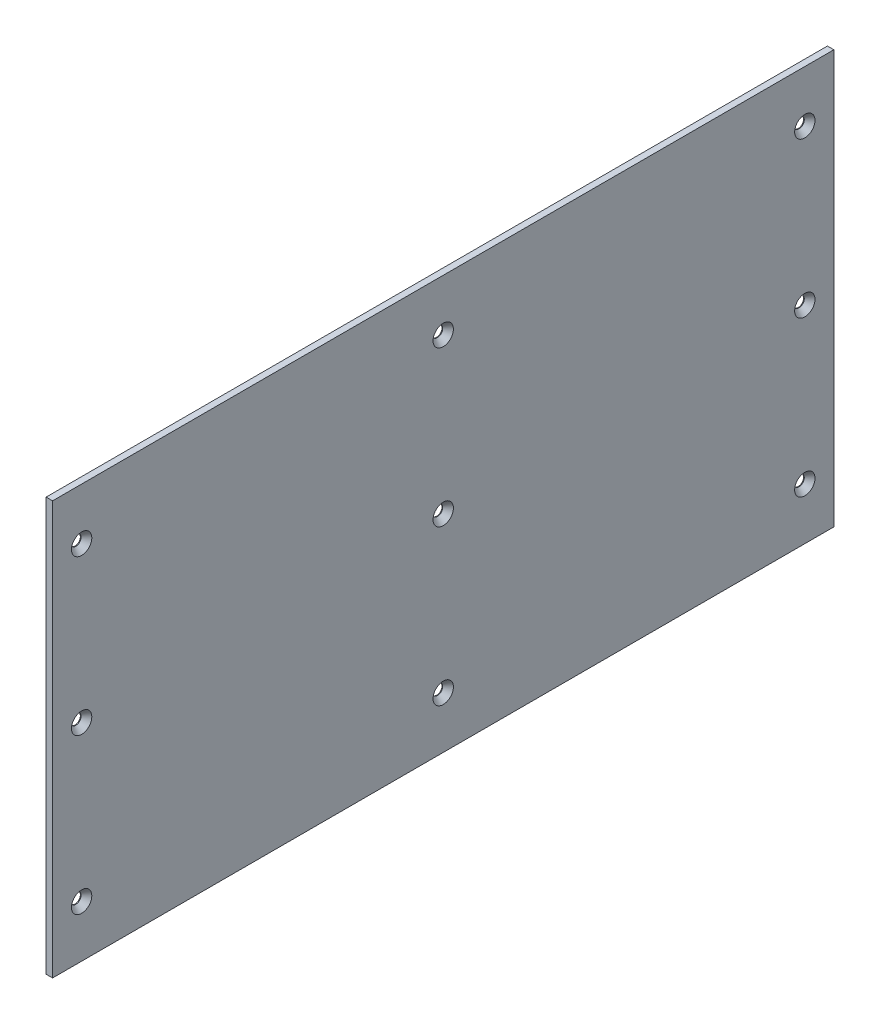
ISO-10303-21;
HEADER;
FILE_DESCRIPTION(('STEP AP214'),'2;1');
FILE_NAME('part.step','',(''),(''),'','','');
FILE_SCHEMA(('AUTOMOTIVE_DESIGN { 1 0 10303 214 1 1 1 1 }'));
ENDSEC;
DATA;
#1=APPLICATION_CONTEXT('core data for automotive mechanical design processes');
#2=APPLICATION_PROTOCOL_DEFINITION('international standard','automotive_design',2000,#1);
#3=PRODUCT_CONTEXT('',#1,'mechanical');
#4=PRODUCT('Part','Part','',(#3));
#5=PRODUCT_RELATED_PRODUCT_CATEGORY('part','',(#4));
#6=PRODUCT_DEFINITION_FORMATION('','',#4);
#7=PRODUCT_DEFINITION_CONTEXT('part definition',#1,'design');
#8=PRODUCT_DEFINITION('design','',#6,#7);
#9=PRODUCT_DEFINITION_SHAPE('','',#8);
#10=(LENGTH_UNIT() NAMED_UNIT(*) SI_UNIT(.MILLI.,.METRE.));
#11=(NAMED_UNIT(*) PLANE_ANGLE_UNIT() SI_UNIT($,.RADIAN.));
#12=(NAMED_UNIT(*) SI_UNIT($,.STERADIAN.) SOLID_ANGLE_UNIT());
#13=UNCERTAINTY_MEASURE_WITH_UNIT(LENGTH_MEASURE(1.E-05),#10,'distance_accuracy_value','');
#14=(GEOMETRIC_REPRESENTATION_CONTEXT(3) GLOBAL_UNCERTAINTY_ASSIGNED_CONTEXT((#13)) GLOBAL_UNIT_ASSIGNED_CONTEXT((#10,
#11,#12)) REPRESENTATION_CONTEXT('',''));
#15=CARTESIAN_POINT('',(0.,0.,0.));
#16=DIRECTION('',(0.,0.,1.));
#17=DIRECTION('',(1.,0.,0.));
#18=AXIS2_PLACEMENT_3D('',#15,#16,#17);
#19=CARTESIAN_POINT('',(3.175,-128.530668257757,187.628102625298));
#20=DIRECTION('',(0.,0.,-1.));
#21=DIRECTION('',(-1.,0.,0.));
#22=AXIS2_PLACEMENT_3D('',#19,#20,#21);
#23=PLANE('',#22);
#24=DIRECTION('',(0.,-1.,0.));
#25=VECTOR('',#24,1.);
#26=CARTESIAN_POINT('',(0.,-128.530668257757,187.628102625298));
#27=LINE('',#26,#25);
#28=CARTESIAN_POINT('',(0.,74.6693317422434,187.628102625298));
#29=VERTEX_POINT('',#28);
#30=CARTESIAN_POINT('',(0.,-128.530668257757,187.628102625298));
#31=VERTEX_POINT('',#30);
#32=EDGE_CURVE('E96',#29,#31,#27,.T.);
#33=ORIENTED_EDGE('',*,*,#32,.T.);
#34=DIRECTION('',(-1.,0.,0.));
#35=VECTOR('',#34,1.);
#36=CARTESIAN_POINT('',(3.175,-128.530668257757,187.628102625298));
#37=LINE('',#36,#35);
#38=CARTESIAN_POINT('',(3.175,-128.530668257757,187.628102625298));
#39=VERTEX_POINT('',#38);
#40=EDGE_CURVE('E11',#39,#31,#37,.T.);
#41=ORIENTED_EDGE('',*,*,#40,.F.);
#42=DIRECTION('',(0.,-1.,0.));
#43=VECTOR('',#42,1.);
#44=CARTESIAN_POINT('',(3.175,-128.530668257757,187.628102625298));
#45=LINE('',#44,#43);
#46=CARTESIAN_POINT('',(3.175,74.6693317422434,187.628102625298));
#47=VERTEX_POINT('',#46);
#48=EDGE_CURVE('E84',#47,#39,#45,.T.);
#49=ORIENTED_EDGE('',*,*,#48,.F.);
#50=DIRECTION('',(-1.,0.,0.));
#51=VECTOR('',#50,1.);
#52=CARTESIAN_POINT('',(3.175,74.6693317422434,187.628102625298));
#53=LINE('',#52,#51);
#54=EDGE_CURVE('E92',#47,#29,#53,.T.);
#55=ORIENTED_EDGE('',*,*,#54,.T.);
#56=EDGE_LOOP('',(#33,#41,#49,#55));
#57=FACE_BOUND('',#56,.T.);
#58=ADVANCED_FACE('F33',(#57),#23,.F.);
#59=CARTESIAN_POINT('',(3.175,-128.530668257757,187.628102625298));
#60=DIRECTION('',(0.,1.,0.));
#61=DIRECTION('',(0.,0.,1.));
#62=AXIS2_PLACEMENT_3D('',#59,#60,#61);
#63=PLANE('',#62);
#64=DIRECTION('',(0.,0.,-1.));
#65=VECTOR('',#64,1.);
#66=CARTESIAN_POINT('',(0.,-128.530668257757,187.628102625298));
#67=LINE('',#66,#65);
#68=CARTESIAN_POINT('',(0.,-128.530668257757,-196.546897374702));
#69=VERTEX_POINT('',#68);
#70=EDGE_CURVE('E88',#31,#69,#67,.T.);
#71=ORIENTED_EDGE('',*,*,#70,.T.);
#72=DIRECTION('',(-1.,0.,0.));
#73=VECTOR('',#72,1.);
#74=CARTESIAN_POINT('',(3.175,-128.530668257757,-196.546897374702));
#75=LINE('',#74,#73);
#76=CARTESIAN_POINT('',(3.175,-128.530668257757,-196.546897374702));
#77=VERTEX_POINT('',#76);
#78=EDGE_CURVE('E41',#77,#69,#75,.T.);
#79=ORIENTED_EDGE('',*,*,#78,.F.);
#80=DIRECTION('',(0.,0.,-1.));
#81=VECTOR('',#80,1.);
#82=CARTESIAN_POINT('',(3.175,-128.530668257757,187.628102625298));
#83=LINE('',#82,#81);
#84=EDGE_CURVE('E79',#39,#77,#83,.T.);
#85=ORIENTED_EDGE('',*,*,#84,.F.);
#86=ORIENTED_EDGE('',*,*,#40,.T.);
#87=EDGE_LOOP('',(#71,#79,#85,#86));
#88=FACE_BOUND('',#87,.T.);
#89=ADVANCED_FACE('F87',(#88),#63,.F.);
#90=CARTESIAN_POINT('',(3.175,-128.530668257757,-196.546897374702));
#91=DIRECTION('',(0.,0.,1.));
#92=DIRECTION('',(1.,0.,0.));
#93=AXIS2_PLACEMENT_3D('',#90,#91,#92);
#94=PLANE('',#93);
#95=DIRECTION('',(0.,1.,0.));
#96=VECTOR('',#95,1.);
#97=CARTESIAN_POINT('',(0.,-128.530668257757,-196.546897374702));
#98=LINE('',#97,#96);
#99=CARTESIAN_POINT('',(0.,74.6693317422434,-196.546897374702));
#100=VERTEX_POINT('',#99);
#101=EDGE_CURVE('E66',#69,#100,#98,.T.);
#102=ORIENTED_EDGE('',*,*,#101,.T.);
#103=DIRECTION('',(-1.,0.,0.));
#104=VECTOR('',#103,1.);
#105=CARTESIAN_POINT('',(3.175,74.6693317422434,-196.546897374702));
#106=LINE('',#105,#104);
#107=CARTESIAN_POINT('',(3.175,74.6693317422434,-196.546897374702));
#108=VERTEX_POINT('',#107);
#109=EDGE_CURVE('E89',#108,#100,#106,.T.);
#110=ORIENTED_EDGE('',*,*,#109,.F.);
#111=DIRECTION('',(0.,1.,0.));
#112=VECTOR('',#111,1.);
#113=CARTESIAN_POINT('',(3.175,-128.530668257757,-196.546897374702));
#114=LINE('',#113,#112);
#115=EDGE_CURVE('E82',#77,#108,#114,.T.);
#116=ORIENTED_EDGE('',*,*,#115,.F.);
#117=ORIENTED_EDGE('',*,*,#78,.T.);
#118=EDGE_LOOP('',(#102,#110,#116,#117));
#119=FACE_BOUND('',#118,.T.);
#120=ADVANCED_FACE('F90',(#119),#94,.F.);
#121=CARTESIAN_POINT('',(3.175,74.6693317422434,187.628102625298));
#122=DIRECTION('',(0.,-1.,0.));
#123=DIRECTION('',(0.,0.,-1.));
#124=AXIS2_PLACEMENT_3D('',#121,#122,#123);
#125=PLANE('',#124);
#126=DIRECTION('',(0.,0.,1.));
#127=VECTOR('',#126,1.);
#128=CARTESIAN_POINT('',(0.,74.6693317422434,187.628102625298));
#129=LINE('',#128,#127);
#130=EDGE_CURVE('E72',#100,#29,#129,.T.);
#131=ORIENTED_EDGE('',*,*,#130,.T.);
#132=ORIENTED_EDGE('',*,*,#54,.F.);
#133=DIRECTION('',(0.,0.,1.));
#134=VECTOR('',#133,1.);
#135=CARTESIAN_POINT('',(3.175,74.6693317422434,187.628102625298));
#136=LINE('',#135,#134);
#137=EDGE_CURVE('E49',#108,#47,#136,.T.);
#138=ORIENTED_EDGE('',*,*,#137,.F.);
#139=ORIENTED_EDGE('',*,*,#109,.T.);
#140=EDGE_LOOP('',(#131,#132,#138,#139));
#141=FACE_BOUND('',#140,.T.);
#142=ADVANCED_FACE('F104',(#141),#125,.F.);
#143=CARTESIAN_POINT('',(3.175,0.,0.));
#144=DIRECTION('',(-1.,0.,0.));
#145=DIRECTION('',(0.,0.,1.));
#146=AXIS2_PLACEMENT_3D('',#143,#144,#145);
#147=PLANE('',#146);
#148=CARTESIAN_POINT('',(3.175,49.2693317422433,-182.259397374702));
#149=DIRECTION('',(1.,0.,0.));
#150=DIRECTION('',(0.,0.,-1.));
#151=AXIS2_PLACEMENT_3D('',#148,#149,#150);
#152=CIRCLE('',#151,4.9999011);
#153=CARTESIAN_POINT('',(3.175,49.2693317422433,-187.259298474702));
#154=VERTEX_POINT('',#153);
#155=EDGE_CURVE('E187',#154,#154,#152,.T.);
#156=ORIENTED_EDGE('',*,*,#155,.F.);
#157=EDGE_LOOP('',(#156));
#158=FACE_BOUND('',#157,.T.);
#159=CARTESIAN_POINT('',(3.175,49.2693317422433,173.340602625298));
#160=DIRECTION('',(1.,0.,0.));
#161=DIRECTION('',(0.,0.,-1.));
#162=AXIS2_PLACEMENT_3D('',#159,#160,#161);
#163=CIRCLE('',#162,4.9999011);
#164=CARTESIAN_POINT('',(3.175,49.2693317422433,168.340701525298));
#165=VERTEX_POINT('',#164);
#166=EDGE_CURVE('E178',#165,#165,#163,.T.);
#167=ORIENTED_EDGE('',*,*,#166,.F.);
#168=EDGE_LOOP('',(#167));
#169=FACE_BOUND('',#168,.T.);
#170=CARTESIAN_POINT('',(3.175,-26.9306682577567,173.340602625298));
#171=DIRECTION('',(1.,0.,0.));
#172=DIRECTION('',(0.,0.,-1.));
#173=AXIS2_PLACEMENT_3D('',#170,#171,#172);
#174=CIRCLE('',#173,4.9999011);
#175=CARTESIAN_POINT('',(3.175,-26.9306682577567,168.340701525298));
#176=VERTEX_POINT('',#175);
#177=EDGE_CURVE('E169',#176,#176,#174,.T.);
#178=ORIENTED_EDGE('',*,*,#177,.F.);
#179=EDGE_LOOP('',(#178));
#180=FACE_BOUND('',#179,.T.);
#181=CARTESIAN_POINT('',(3.175,-103.130668257757,173.340602625298));
#182=DIRECTION('',(1.,0.,0.));
#183=DIRECTION('',(0.,0.,-1.));
#184=AXIS2_PLACEMENT_3D('',#181,#182,#183);
#185=CIRCLE('',#184,4.9999011);
#186=CARTESIAN_POINT('',(3.175,-103.130668257757,168.340701525298));
#187=VERTEX_POINT('',#186);
#188=EDGE_CURVE('E160',#187,#187,#185,.T.);
#189=ORIENTED_EDGE('',*,*,#188,.F.);
#190=EDGE_LOOP('',(#189));
#191=FACE_BOUND('',#190,.T.);
#192=CARTESIAN_POINT('',(3.175,49.2693317422433,-4.45939737470161));
#193=DIRECTION('',(1.,0.,0.));
#194=DIRECTION('',(0.,0.,-1.));
#195=AXIS2_PLACEMENT_3D('',#192,#193,#194);
#196=CIRCLE('',#195,4.9999011);
#197=CARTESIAN_POINT('',(3.175,49.2693317422433,-9.45929847470161));
#198=VERTEX_POINT('',#197);
#199=EDGE_CURVE('E151',#198,#198,#196,.T.);
#200=ORIENTED_EDGE('',*,*,#199,.F.);
#201=EDGE_LOOP('',(#200));
#202=FACE_BOUND('',#201,.T.);
#203=CARTESIAN_POINT('',(3.175,-26.9306682577567,-4.45939737470162));
#204=DIRECTION('',(1.,0.,0.));
#205=DIRECTION('',(0.,0.,-1.));
#206=AXIS2_PLACEMENT_3D('',#203,#204,#205);
#207=CIRCLE('',#206,4.9999011);
#208=CARTESIAN_POINT('',(3.175,-26.9306682577567,-9.45929847470162));
#209=VERTEX_POINT('',#208);
#210=EDGE_CURVE('E142',#209,#209,#207,.T.);
#211=ORIENTED_EDGE('',*,*,#210,.F.);
#212=EDGE_LOOP('',(#211));
#213=FACE_BOUND('',#212,.T.);
#214=CARTESIAN_POINT('',(3.175,-103.130668257757,-4.45939737470163));
#215=DIRECTION('',(1.,0.,0.));
#216=DIRECTION('',(0.,0.,-1.));
#217=AXIS2_PLACEMENT_3D('',#214,#215,#216);
#218=CIRCLE('',#217,4.9999011);
#219=CARTESIAN_POINT('',(3.175,-103.130668257757,-9.45929847470163));
#220=VERTEX_POINT('',#219);
#221=EDGE_CURVE('E133',#220,#220,#218,.T.);
#222=ORIENTED_EDGE('',*,*,#221,.F.);
#223=EDGE_LOOP('',(#222));
#224=FACE_BOUND('',#223,.T.);
#225=CARTESIAN_POINT('',(3.175,-26.9306682577567,-182.259397374702));
#226=DIRECTION('',(1.,0.,0.));
#227=DIRECTION('',(0.,0.,-1.));
#228=AXIS2_PLACEMENT_3D('',#225,#226,#227);
#229=CIRCLE('',#228,4.9999011);
#230=CARTESIAN_POINT('',(3.175,-26.9306682577567,-187.259298474702));
#231=VERTEX_POINT('',#230);
#232=EDGE_CURVE('E124',#231,#231,#229,.T.);
#233=ORIENTED_EDGE('',*,*,#232,.F.);
#234=EDGE_LOOP('',(#233));
#235=FACE_BOUND('',#234,.T.);
#236=CARTESIAN_POINT('',(3.175,-103.130668257757,-182.259397374702));
#237=DIRECTION('',(1.,0.,0.));
#238=DIRECTION('',(0.,0.,-1.));
#239=AXIS2_PLACEMENT_3D('',#236,#237,#238);
#240=CIRCLE('',#239,4.9999011);
#241=CARTESIAN_POINT('',(3.175,-103.130668257757,-187.259298474702));
#242=VERTEX_POINT('',#241);
#243=EDGE_CURVE('E115',#242,#242,#240,.T.);
#244=ORIENTED_EDGE('',*,*,#243,.F.);
#245=EDGE_LOOP('',(#244));
#246=FACE_BOUND('',#245,.T.);
#247=ORIENTED_EDGE('',*,*,#48,.T.);
#248=ORIENTED_EDGE('',*,*,#84,.T.);
#249=ORIENTED_EDGE('',*,*,#115,.T.);
#250=ORIENTED_EDGE('',*,*,#137,.T.);
#251=EDGE_LOOP('',(#247,#248,#249,#250));
#252=FACE_BOUND('',#251,.T.);
#253=ADVANCED_FACE('F80',(#158,#169,#180,#191,#202,#213,#224,#235,#246,#252),#147,.F.);
#254=CARTESIAN_POINT('',(0.,0.,0.));
#255=DIRECTION('',(-1.,0.,0.));
#256=DIRECTION('',(0.,0.,1.));
#257=AXIS2_PLACEMENT_3D('',#254,#255,#256);
#258=PLANE('',#257);
#259=CARTESIAN_POINT('',(0.,49.2693317422433,-182.259397374702));
#260=DIRECTION('',(1.,0.,0.));
#261=DIRECTION('',(0.,0.,-1.));
#262=AXIS2_PLACEMENT_3D('',#259,#260,#261);
#263=CIRCLE('',#262,2.55269999999999);
#264=CARTESIAN_POINT('',(0.,49.2693317422433,-184.812097374702));
#265=VERTEX_POINT('',#264);
#266=EDGE_CURVE('E181',#265,#265,#263,.T.);
#267=ORIENTED_EDGE('',*,*,#266,.T.);
#268=EDGE_LOOP('',(#267));
#269=FACE_BOUND('',#268,.T.);
#270=CARTESIAN_POINT('',(0.,49.2693317422433,173.340602625298));
#271=DIRECTION('',(1.,0.,0.));
#272=DIRECTION('',(0.,0.,-1.));
#273=AXIS2_PLACEMENT_3D('',#270,#271,#272);
#274=CIRCLE('',#273,2.55269999999999);
#275=CARTESIAN_POINT('',(0.,49.2693317422433,170.787902625298));
#276=VERTEX_POINT('',#275);
#277=EDGE_CURVE('E172',#276,#276,#274,.T.);
#278=ORIENTED_EDGE('',*,*,#277,.T.);
#279=EDGE_LOOP('',(#278));
#280=FACE_BOUND('',#279,.T.);
#281=CARTESIAN_POINT('',(0.,-26.9306682577567,173.340602625298));
#282=DIRECTION('',(1.,0.,0.));
#283=DIRECTION('',(0.,0.,-1.));
#284=AXIS2_PLACEMENT_3D('',#281,#282,#283);
#285=CIRCLE('',#284,2.55269999999999);
#286=CARTESIAN_POINT('',(0.,-26.9306682577567,170.787902625298));
#287=VERTEX_POINT('',#286);
#288=EDGE_CURVE('E163',#287,#287,#285,.T.);
#289=ORIENTED_EDGE('',*,*,#288,.T.);
#290=EDGE_LOOP('',(#289));
#291=FACE_BOUND('',#290,.T.);
#292=CARTESIAN_POINT('',(0.,-103.130668257757,173.340602625298));
#293=DIRECTION('',(1.,0.,0.));
#294=DIRECTION('',(0.,0.,-1.));
#295=AXIS2_PLACEMENT_3D('',#292,#293,#294);
#296=CIRCLE('',#295,2.55269999999999);
#297=CARTESIAN_POINT('',(0.,-103.130668257757,170.787902625298));
#298=VERTEX_POINT('',#297);
#299=EDGE_CURVE('E154',#298,#298,#296,.T.);
#300=ORIENTED_EDGE('',*,*,#299,.T.);
#301=EDGE_LOOP('',(#300));
#302=FACE_BOUND('',#301,.T.);
#303=CARTESIAN_POINT('',(0.,49.2693317422433,-4.45939737470161));
#304=DIRECTION('',(1.,0.,0.));
#305=DIRECTION('',(0.,0.,-1.));
#306=AXIS2_PLACEMENT_3D('',#303,#304,#305);
#307=CIRCLE('',#306,2.55269999999999);
#308=CARTESIAN_POINT('',(0.,49.2693317422433,-7.0120973747016));
#309=VERTEX_POINT('',#308);
#310=EDGE_CURVE('E145',#309,#309,#307,.T.);
#311=ORIENTED_EDGE('',*,*,#310,.T.);
#312=EDGE_LOOP('',(#311));
#313=FACE_BOUND('',#312,.T.);
#314=CARTESIAN_POINT('',(0.,-26.9306682577567,-4.45939737470162));
#315=DIRECTION('',(1.,0.,0.));
#316=DIRECTION('',(0.,0.,-1.));
#317=AXIS2_PLACEMENT_3D('',#314,#315,#316);
#318=CIRCLE('',#317,2.55269999999999);
#319=CARTESIAN_POINT('',(0.,-26.9306682577567,-7.01209737470161));
#320=VERTEX_POINT('',#319);
#321=EDGE_CURVE('E136',#320,#320,#318,.T.);
#322=ORIENTED_EDGE('',*,*,#321,.T.);
#323=EDGE_LOOP('',(#322));
#324=FACE_BOUND('',#323,.T.);
#325=CARTESIAN_POINT('',(0.,-103.130668257757,-4.45939737470163));
#326=DIRECTION('',(1.,0.,0.));
#327=DIRECTION('',(0.,0.,-1.));
#328=AXIS2_PLACEMENT_3D('',#325,#326,#327);
#329=CIRCLE('',#328,2.55269999999999);
#330=CARTESIAN_POINT('',(0.,-103.130668257757,-7.01209737470162));
#331=VERTEX_POINT('',#330);
#332=EDGE_CURVE('E127',#331,#331,#329,.T.);
#333=ORIENTED_EDGE('',*,*,#332,.T.);
#334=EDGE_LOOP('',(#333));
#335=FACE_BOUND('',#334,.T.);
#336=CARTESIAN_POINT('',(0.,-26.9306682577567,-182.259397374702));
#337=DIRECTION('',(1.,0.,0.));
#338=DIRECTION('',(0.,0.,-1.));
#339=AXIS2_PLACEMENT_3D('',#336,#337,#338);
#340=CIRCLE('',#339,2.55269999999999);
#341=CARTESIAN_POINT('',(0.,-26.9306682577567,-184.812097374702));
#342=VERTEX_POINT('',#341);
#343=EDGE_CURVE('E118',#342,#342,#340,.T.);
#344=ORIENTED_EDGE('',*,*,#343,.T.);
#345=EDGE_LOOP('',(#344));
#346=FACE_BOUND('',#345,.T.);
#347=CARTESIAN_POINT('',(0.,-103.130668257757,-182.259397374702));
#348=DIRECTION('',(1.,0.,0.));
#349=DIRECTION('',(0.,0.,-1.));
#350=AXIS2_PLACEMENT_3D('',#347,#348,#349);
#351=CIRCLE('',#350,2.55269999999999);
#352=CARTESIAN_POINT('',(0.,-103.130668257757,-184.812097374702));
#353=VERTEX_POINT('',#352);
#354=EDGE_CURVE('E99',#353,#353,#351,.T.);
#355=ORIENTED_EDGE('',*,*,#354,.T.);
#356=EDGE_LOOP('',(#355));
#357=FACE_BOUND('',#356,.T.);
#358=ORIENTED_EDGE('',*,*,#32,.F.);
#359=ORIENTED_EDGE('',*,*,#130,.F.);
#360=ORIENTED_EDGE('',*,*,#101,.F.);
#361=ORIENTED_EDGE('',*,*,#70,.F.);
#362=EDGE_LOOP('',(#358,#359,#360,#361));
#363=FACE_BOUND('',#362,.T.);
#364=ADVANCED_FACE('F107',(#269,#280,#291,#302,#313,#324,#335,#346,#357,#363),#258,.T.);
#365=CARTESIAN_POINT('',(3.175,-103.130668257757,-182.259397374702));
#366=DIRECTION('',(1.,0.,0.));
#367=DIRECTION('',(0.,0.,-1.));
#368=AXIS2_PLACEMENT_3D('',#365,#366,#367);
#369=CYLINDRICAL_SURFACE('',#368,2.55269999999999);
#370=ORIENTED_EDGE('',*,*,#354,.F.);
#371=EDGE_LOOP('',(#370));
#372=FACE_BOUND('',#371,.T.);
#373=CARTESIAN_POINT('',(0.359817168443482,-103.130668257757,-182.259397374702));
#374=DIRECTION('',(1.,0.,0.));
#375=DIRECTION('',(0.,0.,-1.));
#376=AXIS2_PLACEMENT_3D('',#373,#374,#375);
#377=CIRCLE('',#376,2.55269999999999);
#378=CARTESIAN_POINT('',(0.359817168443482,-103.130668257757,-184.812097374702));
#379=VERTEX_POINT('',#378);
#380=EDGE_CURVE('E112',#379,#379,#377,.T.);
#381=ORIENTED_EDGE('',*,*,#380,.T.);
#382=EDGE_LOOP('',(#381));
#383=FACE_BOUND('',#382,.T.);
#384=ADVANCED_FACE('F215',(#372,#383),#369,.F.);
#385=CARTESIAN_POINT('',(3.175,-103.130668257757,-182.259397374702));
#386=DIRECTION('',(1.,0.,0.));
#387=DIRECTION('',(0.,0.,-1.));
#388=AXIS2_PLACEMENT_3D('',#385,#386,#387);
#389=CONICAL_SURFACE('',#388,4.9999011,0.715584993317673);
#390=ORIENTED_EDGE('',*,*,#380,.F.);
#391=EDGE_LOOP('',(#390));
#392=FACE_BOUND('',#391,.T.);
#393=ORIENTED_EDGE('',*,*,#243,.T.);
#394=EDGE_LOOP('',(#393));
#395=FACE_BOUND('',#394,.T.);
#396=ADVANCED_FACE('F212',(#392,#395),#389,.F.);
#397=CARTESIAN_POINT('',(3.175,-26.9306682577567,-182.259397374702));
#398=DIRECTION('',(1.,0.,0.));
#399=DIRECTION('',(0.,0.,-1.));
#400=AXIS2_PLACEMENT_3D('',#397,#398,#399);
#401=CYLINDRICAL_SURFACE('',#400,2.55269999999999);
#402=ORIENTED_EDGE('',*,*,#343,.F.);
#403=EDGE_LOOP('',(#402));
#404=FACE_BOUND('',#403,.T.);
#405=CARTESIAN_POINT('',(0.359817168443482,-26.9306682577567,-182.259397374702));
#406=DIRECTION('',(1.,0.,0.));
#407=DIRECTION('',(0.,0.,-1.));
#408=AXIS2_PLACEMENT_3D('',#405,#406,#407);
#409=CIRCLE('',#408,2.55269999999999);
#410=CARTESIAN_POINT('',(0.359817168443482,-26.9306682577567,-184.812097374702));
#411=VERTEX_POINT('',#410);
#412=EDGE_CURVE('E121',#411,#411,#409,.T.);
#413=ORIENTED_EDGE('',*,*,#412,.T.);
#414=EDGE_LOOP('',(#413));
#415=FACE_BOUND('',#414,.T.);
#416=ADVANCED_FACE('F214',(#404,#415),#401,.F.);
#417=CARTESIAN_POINT('',(3.175,-26.9306682577567,-182.259397374702));
#418=DIRECTION('',(1.,0.,0.));
#419=DIRECTION('',(0.,0.,-1.));
#420=AXIS2_PLACEMENT_3D('',#417,#418,#419);
#421=CONICAL_SURFACE('',#420,4.9999011,0.715584993317674);
#422=ORIENTED_EDGE('',*,*,#412,.F.);
#423=EDGE_LOOP('',(#422));
#424=FACE_BOUND('',#423,.T.);
#425=ORIENTED_EDGE('',*,*,#232,.T.);
#426=EDGE_LOOP('',(#425));
#427=FACE_BOUND('',#426,.T.);
#428=ADVANCED_FACE('F222',(#424,#427),#421,.F.);
#429=CARTESIAN_POINT('',(3.175,-103.130668257757,-4.45939737470163));
#430=DIRECTION('',(1.,0.,0.));
#431=DIRECTION('',(0.,0.,-1.));
#432=AXIS2_PLACEMENT_3D('',#429,#430,#431);
#433=CYLINDRICAL_SURFACE('',#432,2.55269999999999);
#434=ORIENTED_EDGE('',*,*,#332,.F.);
#435=EDGE_LOOP('',(#434));
#436=FACE_BOUND('',#435,.T.);
#437=CARTESIAN_POINT('',(0.359817168443482,-103.130668257757,-4.45939737470163));
#438=DIRECTION('',(1.,0.,0.));
#439=DIRECTION('',(0.,0.,-1.));
#440=AXIS2_PLACEMENT_3D('',#437,#438,#439);
#441=CIRCLE('',#440,2.55269999999999);
#442=CARTESIAN_POINT('',(0.359817168443482,-103.130668257757,-7.01209737470162));
#443=VERTEX_POINT('',#442);
#444=EDGE_CURVE('E130',#443,#443,#441,.T.);
#445=ORIENTED_EDGE('',*,*,#444,.T.);
#446=EDGE_LOOP('',(#445));
#447=FACE_BOUND('',#446,.T.);
#448=ADVANCED_FACE('F266',(#436,#447),#433,.F.);
#449=CARTESIAN_POINT('',(3.175,-103.130668257757,-4.45939737470163));
#450=DIRECTION('',(1.,0.,0.));
#451=DIRECTION('',(0.,0.,-1.));
#452=AXIS2_PLACEMENT_3D('',#449,#450,#451);
#453=CONICAL_SURFACE('',#452,4.9999011,0.715584993317673);
#454=ORIENTED_EDGE('',*,*,#444,.F.);
#455=EDGE_LOOP('',(#454));
#456=FACE_BOUND('',#455,.T.);
#457=ORIENTED_EDGE('',*,*,#221,.T.);
#458=EDGE_LOOP('',(#457));
#459=FACE_BOUND('',#458,.T.);
#460=ADVANCED_FACE('F271',(#456,#459),#453,.F.);
#461=CARTESIAN_POINT('',(3.175,-26.9306682577567,-4.45939737470162));
#462=DIRECTION('',(1.,0.,0.));
#463=DIRECTION('',(0.,0.,-1.));
#464=AXIS2_PLACEMENT_3D('',#461,#462,#463);
#465=CYLINDRICAL_SURFACE('',#464,2.55269999999999);
#466=ORIENTED_EDGE('',*,*,#321,.F.);
#467=EDGE_LOOP('',(#466));
#468=FACE_BOUND('',#467,.T.);
#469=CARTESIAN_POINT('',(0.359817168443482,-26.9306682577567,-4.45939737470162));
#470=DIRECTION('',(1.,0.,0.));
#471=DIRECTION('',(0.,0.,-1.));
#472=AXIS2_PLACEMENT_3D('',#469,#470,#471);
#473=CIRCLE('',#472,2.55269999999999);
#474=CARTESIAN_POINT('',(0.359817168443482,-26.9306682577567,-7.01209737470161));
#475=VERTEX_POINT('',#474);
#476=EDGE_CURVE('E139',#475,#475,#473,.T.);
#477=ORIENTED_EDGE('',*,*,#476,.T.);
#478=EDGE_LOOP('',(#477));
#479=FACE_BOUND('',#478,.T.);
#480=ADVANCED_FACE('F277',(#468,#479),#465,.F.);
#481=CARTESIAN_POINT('',(3.175,-26.9306682577567,-4.45939737470162));
#482=DIRECTION('',(1.,0.,0.));
#483=DIRECTION('',(0.,0.,-1.));
#484=AXIS2_PLACEMENT_3D('',#481,#482,#483);
#485=CONICAL_SURFACE('',#484,4.9999011,0.715584993317674);
#486=ORIENTED_EDGE('',*,*,#476,.F.);
#487=EDGE_LOOP('',(#486));
#488=FACE_BOUND('',#487,.T.);
#489=ORIENTED_EDGE('',*,*,#210,.T.);
#490=EDGE_LOOP('',(#489));
#491=FACE_BOUND('',#490,.T.);
#492=ADVANCED_FACE('F281',(#488,#491),#485,.F.);
#493=CARTESIAN_POINT('',(3.175,49.2693317422433,-4.45939737470161));
#494=DIRECTION('',(1.,0.,0.));
#495=DIRECTION('',(0.,0.,-1.));
#496=AXIS2_PLACEMENT_3D('',#493,#494,#495);
#497=CYLINDRICAL_SURFACE('',#496,2.55269999999999);
#498=ORIENTED_EDGE('',*,*,#310,.F.);
#499=EDGE_LOOP('',(#498));
#500=FACE_BOUND('',#499,.T.);
#501=CARTESIAN_POINT('',(0.359817168443482,49.2693317422433,-4.45939737470161));
#502=DIRECTION('',(1.,0.,0.));
#503=DIRECTION('',(0.,0.,-1.));
#504=AXIS2_PLACEMENT_3D('',#501,#502,#503);
#505=CIRCLE('',#504,2.55269999999999);
#506=CARTESIAN_POINT('',(0.359817168443482,49.2693317422433,-7.0120973747016));
#507=VERTEX_POINT('',#506);
#508=EDGE_CURVE('E148',#507,#507,#505,.T.);
#509=ORIENTED_EDGE('',*,*,#508,.T.);
#510=EDGE_LOOP('',(#509));
#511=FACE_BOUND('',#510,.T.);
#512=ADVANCED_FACE('F285',(#500,#511),#497,.F.);
#513=CARTESIAN_POINT('',(3.175,49.2693317422433,-4.45939737470161));
#514=DIRECTION('',(1.,0.,0.));
#515=DIRECTION('',(0.,0.,-1.));
#516=AXIS2_PLACEMENT_3D('',#513,#514,#515);
#517=CONICAL_SURFACE('',#516,4.9999011,0.715584993317675);
#518=ORIENTED_EDGE('',*,*,#508,.F.);
#519=EDGE_LOOP('',(#518));
#520=FACE_BOUND('',#519,.T.);
#521=ORIENTED_EDGE('',*,*,#199,.T.);
#522=EDGE_LOOP('',(#521));
#523=FACE_BOUND('',#522,.T.);
#524=ADVANCED_FACE('F289',(#520,#523),#517,.F.);
#525=CARTESIAN_POINT('',(3.175,-103.130668257757,173.340602625298));
#526=DIRECTION('',(1.,0.,0.));
#527=DIRECTION('',(0.,0.,-1.));
#528=AXIS2_PLACEMENT_3D('',#525,#526,#527);
#529=CYLINDRICAL_SURFACE('',#528,2.55269999999999);
#530=ORIENTED_EDGE('',*,*,#299,.F.);
#531=EDGE_LOOP('',(#530));
#532=FACE_BOUND('',#531,.T.);
#533=CARTESIAN_POINT('',(0.359817168443482,-103.130668257757,173.340602625298));
#534=DIRECTION('',(1.,0.,0.));
#535=DIRECTION('',(0.,0.,-1.));
#536=AXIS2_PLACEMENT_3D('',#533,#534,#535);
#537=CIRCLE('',#536,2.55269999999999);
#538=CARTESIAN_POINT('',(0.359817168443482,-103.130668257757,170.787902625298));
#539=VERTEX_POINT('',#538);
#540=EDGE_CURVE('E157',#539,#539,#537,.T.);
#541=ORIENTED_EDGE('',*,*,#540,.T.);
#542=EDGE_LOOP('',(#541));
#543=FACE_BOUND('',#542,.T.);
#544=ADVANCED_FACE('F293',(#532,#543),#529,.F.);
#545=CARTESIAN_POINT('',(3.175,-103.130668257757,173.340602625298));
#546=DIRECTION('',(1.,0.,0.));
#547=DIRECTION('',(0.,0.,-1.));
#548=AXIS2_PLACEMENT_3D('',#545,#546,#547);
#549=CONICAL_SURFACE('',#548,4.9999011,0.715584993317673);
#550=ORIENTED_EDGE('',*,*,#540,.F.);
#551=EDGE_LOOP('',(#550));
#552=FACE_BOUND('',#551,.T.);
#553=ORIENTED_EDGE('',*,*,#188,.T.);
#554=EDGE_LOOP('',(#553));
#555=FACE_BOUND('',#554,.T.);
#556=ADVANCED_FACE('F297',(#552,#555),#549,.F.);
#557=CARTESIAN_POINT('',(3.175,-26.9306682577567,173.340602625298));
#558=DIRECTION('',(1.,0.,0.));
#559=DIRECTION('',(0.,0.,-1.));
#560=AXIS2_PLACEMENT_3D('',#557,#558,#559);
#561=CYLINDRICAL_SURFACE('',#560,2.55269999999999);
#562=ORIENTED_EDGE('',*,*,#288,.F.);
#563=EDGE_LOOP('',(#562));
#564=FACE_BOUND('',#563,.T.);
#565=CARTESIAN_POINT('',(0.359817168443482,-26.9306682577567,173.340602625298));
#566=DIRECTION('',(1.,0.,0.));
#567=DIRECTION('',(0.,0.,-1.));
#568=AXIS2_PLACEMENT_3D('',#565,#566,#567);
#569=CIRCLE('',#568,2.55269999999999);
#570=CARTESIAN_POINT('',(0.359817168443482,-26.9306682577567,170.787902625298));
#571=VERTEX_POINT('',#570);
#572=EDGE_CURVE('E166',#571,#571,#569,.T.);
#573=ORIENTED_EDGE('',*,*,#572,.T.);
#574=EDGE_LOOP('',(#573));
#575=FACE_BOUND('',#574,.T.);
#576=ADVANCED_FACE('F301',(#564,#575),#561,.F.);
#577=CARTESIAN_POINT('',(3.175,-26.9306682577567,173.340602625298));
#578=DIRECTION('',(1.,0.,0.));
#579=DIRECTION('',(0.,0.,-1.));
#580=AXIS2_PLACEMENT_3D('',#577,#578,#579);
#581=CONICAL_SURFACE('',#580,4.9999011,0.715584993317674);
#582=ORIENTED_EDGE('',*,*,#572,.F.);
#583=EDGE_LOOP('',(#582));
#584=FACE_BOUND('',#583,.T.);
#585=ORIENTED_EDGE('',*,*,#177,.T.);
#586=EDGE_LOOP('',(#585));
#587=FACE_BOUND('',#586,.T.);
#588=ADVANCED_FACE('F305',(#584,#587),#581,.F.);
#589=CARTESIAN_POINT('',(3.175,49.2693317422433,173.340602625298));
#590=DIRECTION('',(1.,0.,0.));
#591=DIRECTION('',(0.,0.,-1.));
#592=AXIS2_PLACEMENT_3D('',#589,#590,#591);
#593=CYLINDRICAL_SURFACE('',#592,2.55269999999999);
#594=ORIENTED_EDGE('',*,*,#277,.F.);
#595=EDGE_LOOP('',(#594));
#596=FACE_BOUND('',#595,.T.);
#597=CARTESIAN_POINT('',(0.359817168443482,49.2693317422433,173.340602625298));
#598=DIRECTION('',(1.,0.,0.));
#599=DIRECTION('',(0.,0.,-1.));
#600=AXIS2_PLACEMENT_3D('',#597,#598,#599);
#601=CIRCLE('',#600,2.55269999999999);
#602=CARTESIAN_POINT('',(0.359817168443482,49.2693317422433,170.787902625298));
#603=VERTEX_POINT('',#602);
#604=EDGE_CURVE('E175',#603,#603,#601,.T.);
#605=ORIENTED_EDGE('',*,*,#604,.T.);
#606=EDGE_LOOP('',(#605));
#607=FACE_BOUND('',#606,.T.);
#608=ADVANCED_FACE('F309',(#596,#607),#593,.F.);
#609=CARTESIAN_POINT('',(3.175,49.2693317422433,173.340602625298));
#610=DIRECTION('',(1.,0.,0.));
#611=DIRECTION('',(0.,0.,-1.));
#612=AXIS2_PLACEMENT_3D('',#609,#610,#611);
#613=CONICAL_SURFACE('',#612,4.9999011,0.715584993317675);
#614=ORIENTED_EDGE('',*,*,#604,.F.);
#615=EDGE_LOOP('',(#614));
#616=FACE_BOUND('',#615,.T.);
#617=ORIENTED_EDGE('',*,*,#166,.T.);
#618=EDGE_LOOP('',(#617));
#619=FACE_BOUND('',#618,.T.);
#620=ADVANCED_FACE('F313',(#616,#619),#613,.F.);
#621=CARTESIAN_POINT('',(3.175,49.2693317422433,-182.259397374702));
#622=DIRECTION('',(1.,0.,0.));
#623=DIRECTION('',(0.,0.,-1.));
#624=AXIS2_PLACEMENT_3D('',#621,#622,#623);
#625=CYLINDRICAL_SURFACE('',#624,2.55269999999999);
#626=ORIENTED_EDGE('',*,*,#266,.F.);
#627=EDGE_LOOP('',(#626));
#628=FACE_BOUND('',#627,.T.);
#629=CARTESIAN_POINT('',(0.359817168443496,49.2693317422433,-182.259397374702));
#630=DIRECTION('',(1.,0.,0.));
#631=DIRECTION('',(0.,0.,-1.));
#632=AXIS2_PLACEMENT_3D('',#629,#630,#631);
#633=CIRCLE('',#632,2.55269999999998);
#634=CARTESIAN_POINT('',(0.359817168443496,49.2693317422433,-184.812097374702));
#635=VERTEX_POINT('',#634);
#636=EDGE_CURVE('E184',#635,#635,#633,.T.);
#637=ORIENTED_EDGE('',*,*,#636,.T.);
#638=EDGE_LOOP('',(#637));
#639=FACE_BOUND('',#638,.T.);
#640=ADVANCED_FACE('F317',(#628,#639),#625,.F.);
#641=CARTESIAN_POINT('',(3.175,49.2693317422433,-182.259397374702));
#642=DIRECTION('',(1.,0.,0.));
#643=DIRECTION('',(0.,0.,-1.));
#644=AXIS2_PLACEMENT_3D('',#641,#642,#643);
#645=CONICAL_SURFACE('',#644,4.9999011,0.715584993317678);
#646=ORIENTED_EDGE('',*,*,#636,.F.);
#647=EDGE_LOOP('',(#646));
#648=FACE_BOUND('',#647,.T.);
#649=ORIENTED_EDGE('',*,*,#155,.T.);
#650=EDGE_LOOP('',(#649));
#651=FACE_BOUND('',#650,.T.);
#652=ADVANCED_FACE('F191',(#648,#651),#645,.F.);
#653=CLOSED_SHELL('',(#58,#89,#120,#142,#253,#364,#384,#396,#416,#428,#448,#460,#480,#492,#512,
#524,#544,#556,#576,#588,#608,#620,#640,#652));
#654=MANIFOLD_SOLID_BREP('B2',#653);
#655=ADVANCED_BREP_SHAPE_REPRESENTATION('',(#18,#654),#14);
#656=SHAPE_DEFINITION_REPRESENTATION(#9,#655);
ENDSEC;
END-ISO-10303-21;
